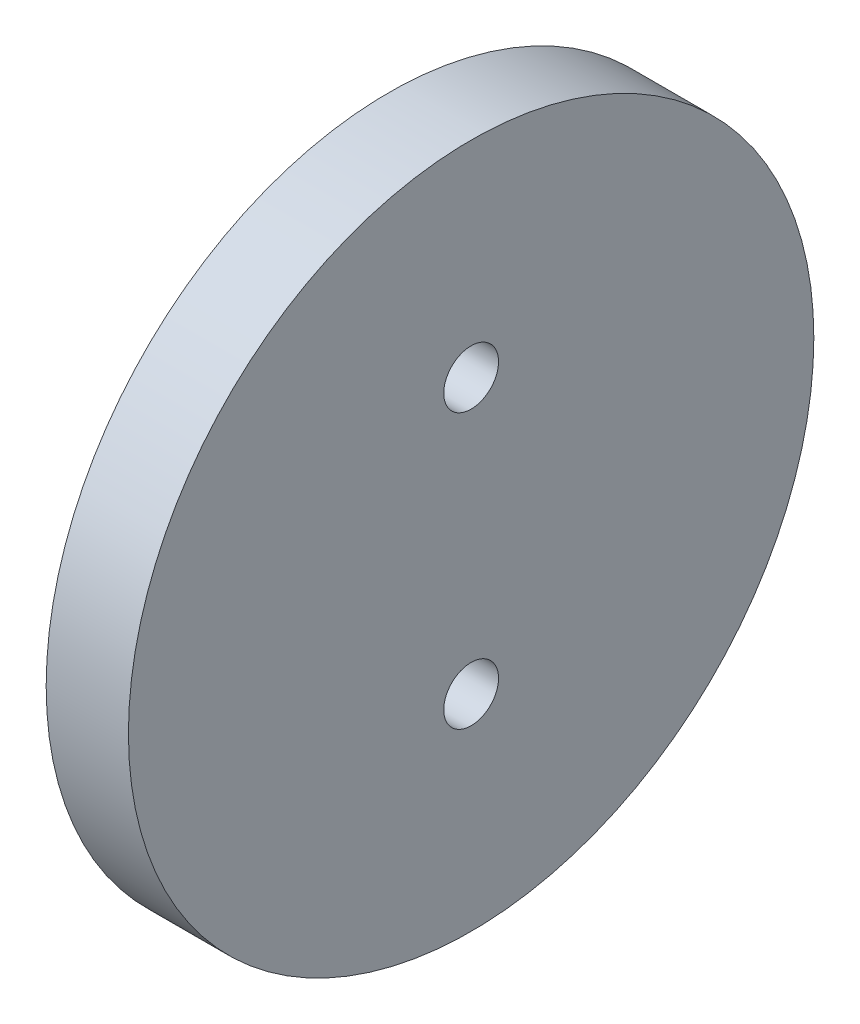
ISO-10303-21;
HEADER;
FILE_DESCRIPTION(('STEP AP214'),'2;1');
FILE_NAME('part.step','',(''),(''),'','','');
FILE_SCHEMA(('AUTOMOTIVE_DESIGN { 1 0 10303 214 1 1 1 1 }'));
ENDSEC;
DATA;
#1=APPLICATION_CONTEXT('core data for automotive mechanical design processes');
#2=APPLICATION_PROTOCOL_DEFINITION('international standard','automotive_design',2000,#1);
#3=PRODUCT_CONTEXT('',#1,'mechanical');
#4=PRODUCT('Part','Part','',(#3));
#5=PRODUCT_RELATED_PRODUCT_CATEGORY('part','',(#4));
#6=PRODUCT_DEFINITION_FORMATION('','',#4);
#7=PRODUCT_DEFINITION_CONTEXT('part definition',#1,'design');
#8=PRODUCT_DEFINITION('design','',#6,#7);
#9=PRODUCT_DEFINITION_SHAPE('','',#8);
#10=(LENGTH_UNIT() NAMED_UNIT(*) SI_UNIT(.MILLI.,.METRE.));
#11=(NAMED_UNIT(*) PLANE_ANGLE_UNIT() SI_UNIT($,.RADIAN.));
#12=(NAMED_UNIT(*) SI_UNIT($,.STERADIAN.) SOLID_ANGLE_UNIT());
#13=UNCERTAINTY_MEASURE_WITH_UNIT(LENGTH_MEASURE(1.E-05),#10,'distance_accuracy_value','');
#14=(GEOMETRIC_REPRESENTATION_CONTEXT(3) GLOBAL_UNCERTAINTY_ASSIGNED_CONTEXT((#13)) GLOBAL_UNIT_ASSIGNED_CONTEXT((#10,
#11,#12)) REPRESENTATION_CONTEXT('',''));
#15=CARTESIAN_POINT('',(0.,0.,0.));
#16=DIRECTION('',(0.,0.,1.));
#17=DIRECTION('',(1.,0.,0.));
#18=AXIS2_PLACEMENT_3D('',#15,#16,#17);
#19=CARTESIAN_POINT('',(3.,0.,0.));
#20=DIRECTION('',(-1.,0.,0.));
#21=DIRECTION('',(0.,0.,1.));
#22=AXIS2_PLACEMENT_3D('',#19,#20,#21);
#23=CYLINDRICAL_SURFACE('',#22,12.5);
#24=CARTESIAN_POINT('',(3.,0.,0.));
#25=DIRECTION('',(1.,0.,0.));
#26=DIRECTION('',(0.,0.,-1.));
#27=AXIS2_PLACEMENT_3D('',#24,#25,#26);
#28=CIRCLE('',#27,12.5);
#29=CARTESIAN_POINT('',(3.,0.,-12.5));
#30=VERTEX_POINT('',#29);
#31=EDGE_CURVE('E10',#30,#30,#28,.T.);
#32=ORIENTED_EDGE('',*,*,#31,.F.);
#33=EDGE_LOOP('',(#32));
#34=FACE_BOUND('',#33,.T.);
#35=CARTESIAN_POINT('',(0.,0.,0.));
#36=DIRECTION('',(1.,0.,0.));
#37=DIRECTION('',(0.,0.,-1.));
#38=AXIS2_PLACEMENT_3D('',#35,#36,#37);
#39=CIRCLE('',#38,12.5);
#40=CARTESIAN_POINT('',(0.,0.,-12.5));
#41=VERTEX_POINT('',#40);
#42=EDGE_CURVE('E39',#41,#41,#39,.T.);
#43=ORIENTED_EDGE('',*,*,#42,.T.);
#44=EDGE_LOOP('',(#43));
#45=FACE_BOUND('',#44,.T.);
#46=ADVANCED_FACE('F36',(#34,#45),#23,.T.);
#47=CARTESIAN_POINT('',(3.,0.,0.));
#48=DIRECTION('',(1.,0.,0.));
#49=DIRECTION('',(0.,0.,-1.));
#50=AXIS2_PLACEMENT_3D('',#47,#48,#49);
#51=PLANE('',#50);
#52=CARTESIAN_POINT('',(3.,5.,0.));
#53=DIRECTION('',(1.,0.,0.));
#54=DIRECTION('',(0.,0.,-1.));
#55=AXIS2_PLACEMENT_3D('',#52,#53,#54);
#56=CIRCLE('',#55,1.);
#57=CARTESIAN_POINT('',(3.,5.,-1.));
#58=VERTEX_POINT('',#57);
#59=EDGE_CURVE('E54',#58,#58,#56,.T.);
#60=ORIENTED_EDGE('',*,*,#59,.F.);
#61=EDGE_LOOP('',(#60));
#62=FACE_BOUND('',#61,.T.);
#63=CARTESIAN_POINT('',(3.,-5.,0.));
#64=DIRECTION('',(1.,0.,0.));
#65=DIRECTION('',(0.,0.,-1.));
#66=AXIS2_PLACEMENT_3D('',#63,#64,#65);
#67=CIRCLE('',#66,1.);
#68=CARTESIAN_POINT('',(3.,-5.,-1.));
#69=VERTEX_POINT('',#68);
#70=EDGE_CURVE('E48',#69,#69,#67,.T.);
#71=ORIENTED_EDGE('',*,*,#70,.F.);
#72=EDGE_LOOP('',(#71));
#73=FACE_BOUND('',#72,.T.);
#74=ORIENTED_EDGE('',*,*,#31,.T.);
#75=EDGE_LOOP('',(#74));
#76=FACE_BOUND('',#75,.T.);
#77=ADVANCED_FACE('F70',(#62,#73,#76),#51,.T.);
#78=CARTESIAN_POINT('',(0.,0.,0.));
#79=DIRECTION('',(1.,0.,0.));
#80=DIRECTION('',(0.,0.,-1.));
#81=AXIS2_PLACEMENT_3D('',#78,#79,#80);
#82=PLANE('',#81);
#83=CARTESIAN_POINT('',(0.,5.,0.));
#84=DIRECTION('',(1.,0.,0.));
#85=DIRECTION('',(0.,0.,-1.));
#86=AXIS2_PLACEMENT_3D('',#83,#84,#85);
#87=CIRCLE('',#86,1.);
#88=CARTESIAN_POINT('',(0.,5.,-1.));
#89=VERTEX_POINT('',#88);
#90=EDGE_CURVE('E46',#89,#89,#87,.T.);
#91=ORIENTED_EDGE('',*,*,#90,.T.);
#92=EDGE_LOOP('',(#91));
#93=FACE_BOUND('',#92,.T.);
#94=CARTESIAN_POINT('',(0.,-5.,0.));
#95=DIRECTION('',(1.,0.,0.));
#96=DIRECTION('',(0.,0.,-1.));
#97=AXIS2_PLACEMENT_3D('',#94,#95,#96);
#98=CIRCLE('',#97,1.);
#99=CARTESIAN_POINT('',(0.,-5.,-1.));
#100=VERTEX_POINT('',#99);
#101=EDGE_CURVE('E51',#100,#100,#98,.T.);
#102=ORIENTED_EDGE('',*,*,#101,.T.);
#103=EDGE_LOOP('',(#102));
#104=FACE_BOUND('',#103,.T.);
#105=ORIENTED_EDGE('',*,*,#42,.F.);
#106=EDGE_LOOP('',(#105));
#107=FACE_BOUND('',#106,.T.);
#108=ADVANCED_FACE('F60',(#93,#104,#107),#82,.F.);
#109=CARTESIAN_POINT('',(0.,-5.,0.));
#110=DIRECTION('',(1.,0.,0.));
#111=DIRECTION('',(0.,0.,-1.));
#112=AXIS2_PLACEMENT_3D('',#109,#110,#111);
#113=CYLINDRICAL_SURFACE('',#112,1.);
#114=ORIENTED_EDGE('',*,*,#101,.F.);
#115=EDGE_LOOP('',(#114));
#116=FACE_BOUND('',#115,.T.);
#117=ORIENTED_EDGE('',*,*,#70,.T.);
#118=EDGE_LOOP('',(#117));
#119=FACE_BOUND('',#118,.T.);
#120=ADVANCED_FACE('F66',(#116,#119),#113,.F.);
#121=CARTESIAN_POINT('',(0.,5.,0.));
#122=DIRECTION('',(1.,0.,0.));
#123=DIRECTION('',(0.,0.,-1.));
#124=AXIS2_PLACEMENT_3D('',#121,#122,#123);
#125=CYLINDRICAL_SURFACE('',#124,1.);
#126=ORIENTED_EDGE('',*,*,#90,.F.);
#127=EDGE_LOOP('',(#126));
#128=FACE_BOUND('',#127,.T.);
#129=ORIENTED_EDGE('',*,*,#59,.T.);
#130=EDGE_LOOP('',(#129));
#131=FACE_BOUND('',#130,.T.);
#132=ADVANCED_FACE('F63',(#128,#131),#125,.F.);
#133=CLOSED_SHELL('',(#46,#77,#108,#120,#132));
#134=MANIFOLD_SOLID_BREP('B2',#133);
#135=ADVANCED_BREP_SHAPE_REPRESENTATION('',(#18,#134),#14);
#136=SHAPE_DEFINITION_REPRESENTATION(#9,#135);
ENDSEC;
END-ISO-10303-21;
